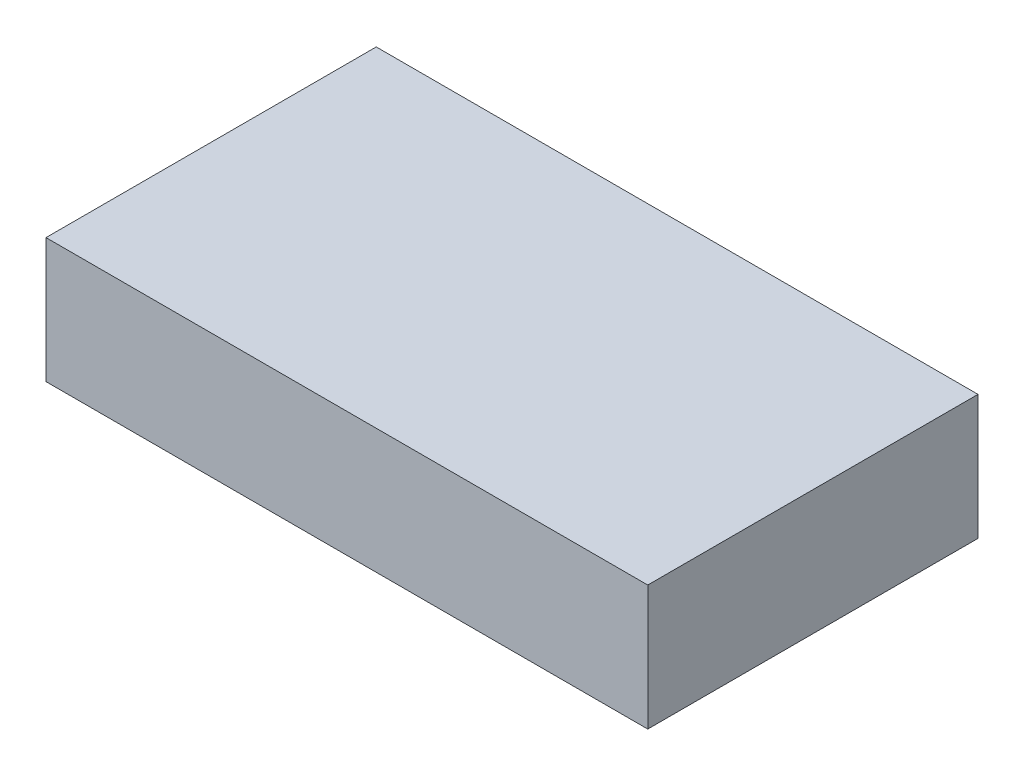
ISO-10303-21;
HEADER;
FILE_DESCRIPTION(('STEP AP214'),'2;1');
FILE_NAME('part.step','',(''),(''),'','','');
FILE_SCHEMA(('AUTOMOTIVE_DESIGN { 1 0 10303 214 1 1 1 1 }'));
ENDSEC;
DATA;
#1=APPLICATION_CONTEXT('core data for automotive mechanical design processes');
#2=APPLICATION_PROTOCOL_DEFINITION('international standard','automotive_design',2000,#1);
#3=PRODUCT_CONTEXT('',#1,'mechanical');
#4=PRODUCT('Part','Part','',(#3));
#5=PRODUCT_RELATED_PRODUCT_CATEGORY('part','',(#4));
#6=PRODUCT_DEFINITION_FORMATION('','',#4);
#7=PRODUCT_DEFINITION_CONTEXT('part definition',#1,'design');
#8=PRODUCT_DEFINITION('design','',#6,#7);
#9=PRODUCT_DEFINITION_SHAPE('','',#8);
#10=(LENGTH_UNIT() NAMED_UNIT(*) SI_UNIT(.MILLI.,.METRE.));
#11=(NAMED_UNIT(*) PLANE_ANGLE_UNIT() SI_UNIT($,.RADIAN.));
#12=(NAMED_UNIT(*) SI_UNIT($,.STERADIAN.) SOLID_ANGLE_UNIT());
#13=UNCERTAINTY_MEASURE_WITH_UNIT(LENGTH_MEASURE(1.E-05),#10,'distance_accuracy_value','');
#14=(GEOMETRIC_REPRESENTATION_CONTEXT(3) GLOBAL_UNCERTAINTY_ASSIGNED_CONTEXT((#13)) GLOBAL_UNIT_ASSIGNED_CONTEXT((#10,
#11,#12)) REPRESENTATION_CONTEXT('',''));
#15=CARTESIAN_POINT('',(0.,0.,0.));
#16=DIRECTION('',(0.,0.,1.));
#17=DIRECTION('',(1.,0.,0.));
#18=AXIS2_PLACEMENT_3D('',#15,#16,#17);
#19=CARTESIAN_POINT('',(0.,17.,0.));
#20=DIRECTION('',(1.,0.,0.));
#21=DIRECTION('',(0.,0.,-1.));
#22=AXIS2_PLACEMENT_3D('',#19,#20,#21);
#23=PLANE('',#22);
#24=DIRECTION('',(0.,0.,1.));
#25=VECTOR('',#24,1.);
#26=CARTESIAN_POINT('',(0.,0.,0.));
#27=LINE('',#26,#25);
#28=CARTESIAN_POINT('',(0.,0.,-45.));
#29=VERTEX_POINT('',#28);
#30=CARTESIAN_POINT('',(0.,0.,0.));
#31=VERTEX_POINT('',#30);
#32=EDGE_CURVE('E107',#29,#31,#27,.T.);
#33=ORIENTED_EDGE('',*,*,#32,.T.);
#34=DIRECTION('',(0.,-1.,0.));
#35=VECTOR('',#34,1.);
#36=CARTESIAN_POINT('',(0.,17.,0.));
#37=LINE('',#36,#35);
#38=CARTESIAN_POINT('',(0.,17.,0.));
#39=VERTEX_POINT('',#38);
#40=EDGE_CURVE('E11',#39,#31,#37,.T.);
#41=ORIENTED_EDGE('',*,*,#40,.F.);
#42=DIRECTION('',(0.,0.,1.));
#43=VECTOR('',#42,1.);
#44=CARTESIAN_POINT('',(0.,17.,0.));
#45=LINE('',#44,#43);
#46=CARTESIAN_POINT('',(0.,17.,-45.));
#47=VERTEX_POINT('',#46);
#48=EDGE_CURVE('E91',#47,#39,#45,.T.);
#49=ORIENTED_EDGE('',*,*,#48,.F.);
#50=DIRECTION('',(0.,-1.,0.));
#51=VECTOR('',#50,1.);
#52=CARTESIAN_POINT('',(0.,17.,-45.));
#53=LINE('',#52,#51);
#54=EDGE_CURVE('E103',#47,#29,#53,.T.);
#55=ORIENTED_EDGE('',*,*,#54,.T.);
#56=EDGE_LOOP('',(#33,#41,#49,#55));
#57=FACE_BOUND('',#56,.T.);
#58=ADVANCED_FACE('F39',(#57),#23,.F.);
#59=CARTESIAN_POINT('',(0.,17.,0.));
#60=DIRECTION('',(0.,0.,-1.));
#61=DIRECTION('',(-1.,0.,0.));
#62=AXIS2_PLACEMENT_3D('',#59,#60,#61);
#63=PLANE('',#62);
#64=DIRECTION('',(1.,0.,0.));
#65=VECTOR('',#64,1.);
#66=CARTESIAN_POINT('',(0.,0.,0.));
#67=LINE('',#66,#65);
#68=CARTESIAN_POINT('',(82.,0.,0.));
#69=VERTEX_POINT('',#68);
#70=EDGE_CURVE('E96',#31,#69,#67,.T.);
#71=ORIENTED_EDGE('',*,*,#70,.T.);
#72=DIRECTION('',(0.,-1.,0.));
#73=VECTOR('',#72,1.);
#74=CARTESIAN_POINT('',(82.,17.,0.));
#75=LINE('',#74,#73);
#76=CARTESIAN_POINT('',(82.,17.,0.));
#77=VERTEX_POINT('',#76);
#78=EDGE_CURVE('E48',#77,#69,#75,.T.);
#79=ORIENTED_EDGE('',*,*,#78,.F.);
#80=DIRECTION('',(1.,0.,0.));
#81=VECTOR('',#80,1.);
#82=CARTESIAN_POINT('',(0.,17.,0.));
#83=LINE('',#82,#81);
#84=EDGE_CURVE('E86',#39,#77,#83,.T.);
#85=ORIENTED_EDGE('',*,*,#84,.F.);
#86=ORIENTED_EDGE('',*,*,#40,.T.);
#87=EDGE_LOOP('',(#71,#79,#85,#86));
#88=FACE_BOUND('',#87,.T.);
#89=ADVANCED_FACE('F95',(#88),#63,.F.);
#90=CARTESIAN_POINT('',(82.,17.,0.));
#91=DIRECTION('',(-1.,0.,0.));
#92=DIRECTION('',(0.,0.,1.));
#93=AXIS2_PLACEMENT_3D('',#90,#91,#92);
#94=PLANE('',#93);
#95=DIRECTION('',(0.,0.,-1.));
#96=VECTOR('',#95,1.);
#97=CARTESIAN_POINT('',(82.,0.,0.));
#98=LINE('',#97,#96);
#99=CARTESIAN_POINT('',(82.,0.,-45.));
#100=VERTEX_POINT('',#99);
#101=EDGE_CURVE('E73',#69,#100,#98,.T.);
#102=ORIENTED_EDGE('',*,*,#101,.T.);
#103=DIRECTION('',(0.,-1.,0.));
#104=VECTOR('',#103,1.);
#105=CARTESIAN_POINT('',(82.,17.,-45.));
#106=LINE('',#105,#104);
#107=CARTESIAN_POINT('',(82.,17.,-45.));
#108=VERTEX_POINT('',#107);
#109=EDGE_CURVE('E98',#108,#100,#106,.T.);
#110=ORIENTED_EDGE('',*,*,#109,.F.);
#111=DIRECTION('',(0.,0.,-1.));
#112=VECTOR('',#111,1.);
#113=CARTESIAN_POINT('',(82.,17.,0.));
#114=LINE('',#113,#112);
#115=EDGE_CURVE('E89',#77,#108,#114,.T.);
#116=ORIENTED_EDGE('',*,*,#115,.F.);
#117=ORIENTED_EDGE('',*,*,#78,.T.);
#118=EDGE_LOOP('',(#102,#110,#116,#117));
#119=FACE_BOUND('',#118,.T.);
#120=ADVANCED_FACE('F99',(#119),#94,.F.);
#121=CARTESIAN_POINT('',(0.,17.,-45.));
#122=DIRECTION('',(0.,0.,1.));
#123=DIRECTION('',(1.,0.,0.));
#124=AXIS2_PLACEMENT_3D('',#121,#122,#123);
#125=PLANE('',#124);
#126=DIRECTION('',(-1.,0.,0.));
#127=VECTOR('',#126,1.);
#128=CARTESIAN_POINT('',(0.,0.,-45.));
#129=LINE('',#128,#127);
#130=EDGE_CURVE('E79',#100,#29,#129,.T.);
#131=ORIENTED_EDGE('',*,*,#130,.T.);
#132=ORIENTED_EDGE('',*,*,#54,.F.);
#133=DIRECTION('',(-1.,0.,0.));
#134=VECTOR('',#133,1.);
#135=CARTESIAN_POINT('',(0.,17.,-45.));
#136=LINE('',#135,#134);
#137=EDGE_CURVE('E56',#108,#47,#136,.T.);
#138=ORIENTED_EDGE('',*,*,#137,.F.);
#139=ORIENTED_EDGE('',*,*,#109,.T.);
#140=EDGE_LOOP('',(#131,#132,#138,#139));
#141=FACE_BOUND('',#140,.T.);
#142=ADVANCED_FACE('F120',(#141),#125,.F.);
#143=CARTESIAN_POINT('',(0.,17.,0.));
#144=DIRECTION('',(0.,-1.,0.));
#145=DIRECTION('',(0.,0.,-1.));
#146=AXIS2_PLACEMENT_3D('',#143,#144,#145);
#147=PLANE('',#146);
#148=ORIENTED_EDGE('',*,*,#48,.T.);
#149=ORIENTED_EDGE('',*,*,#84,.T.);
#150=ORIENTED_EDGE('',*,*,#115,.T.);
#151=ORIENTED_EDGE('',*,*,#137,.T.);
#152=EDGE_LOOP('',(#148,#149,#150,#151));
#153=FACE_BOUND('',#152,.T.);
#154=ADVANCED_FACE('F87',(#153),#147,.F.);
#155=CARTESIAN_POINT('',(0.,0.,0.));
#156=DIRECTION('',(0.,-1.,0.));
#157=DIRECTION('',(0.,0.,-1.));
#158=AXIS2_PLACEMENT_3D('',#155,#156,#157);
#159=PLANE('',#158);
#160=ORIENTED_EDGE('',*,*,#32,.F.);
#161=ORIENTED_EDGE('',*,*,#130,.F.);
#162=ORIENTED_EDGE('',*,*,#101,.F.);
#163=ORIENTED_EDGE('',*,*,#70,.F.);
#164=EDGE_LOOP('',(#160,#161,#162,#163));
#165=FACE_BOUND('',#164,.T.);
#166=ADVANCED_FACE('F123',(#165),#159,.T.);
#167=CLOSED_SHELL('',(#58,#89,#120,#142,#154,#166));
#168=MANIFOLD_SOLID_BREP('B2',#167);
#169=ADVANCED_BREP_SHAPE_REPRESENTATION('',(#18,#168),#14);
#170=SHAPE_DEFINITION_REPRESENTATION(#9,#169);
ENDSEC;
END-ISO-10303-21;
